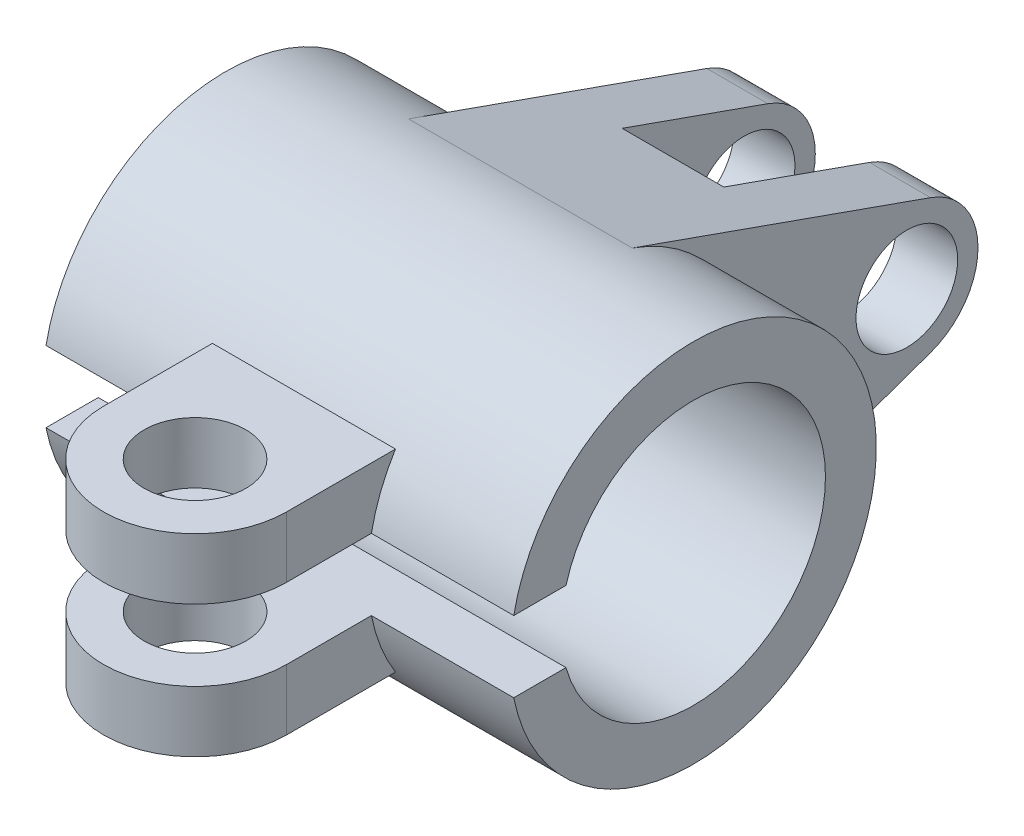
ISO-10303-21;
HEADER;
FILE_DESCRIPTION(('STEP AP214'),'2;1');
FILE_NAME('part.step','',(''),(''),'','','');
FILE_SCHEMA(('AUTOMOTIVE_DESIGN { 1 0 10303 214 1 1 1 1 }'));
ENDSEC;
DATA;
#1=APPLICATION_CONTEXT('core data for automotive mechanical design processes');
#2=APPLICATION_PROTOCOL_DEFINITION('international standard','automotive_design',2000,#1);
#3=PRODUCT_CONTEXT('',#1,'mechanical');
#4=PRODUCT('Part','Part','',(#3));
#5=PRODUCT_RELATED_PRODUCT_CATEGORY('part','',(#4));
#6=PRODUCT_DEFINITION_FORMATION('','',#4);
#7=PRODUCT_DEFINITION_CONTEXT('part definition',#1,'design');
#8=PRODUCT_DEFINITION('design','',#6,#7);
#9=PRODUCT_DEFINITION_SHAPE('','',#8);
#10=(LENGTH_UNIT() NAMED_UNIT(*) SI_UNIT(.MILLI.,.METRE.));
#11=(NAMED_UNIT(*) PLANE_ANGLE_UNIT() SI_UNIT($,.RADIAN.));
#12=(NAMED_UNIT(*) SI_UNIT($,.STERADIAN.) SOLID_ANGLE_UNIT());
#13=UNCERTAINTY_MEASURE_WITH_UNIT(LENGTH_MEASURE(1.E-05),#10,'distance_accuracy_value','');
#14=(GEOMETRIC_REPRESENTATION_CONTEXT(3) GLOBAL_UNCERTAINTY_ASSIGNED_CONTEXT((#13)) GLOBAL_UNIT_ASSIGNED_CONTEXT((#10,
#11,#12)) REPRESENTATION_CONTEXT('',''));
#15=CARTESIAN_POINT('',(0.,0.,0.));
#16=DIRECTION('',(0.,0.,1.));
#17=DIRECTION('',(1.,0.,0.));
#18=AXIS2_PLACEMENT_3D('',#15,#16,#17);
#19=CARTESIAN_POINT('',(0.,-3.5,26.));
#20=DIRECTION('',(0.,-1.,0.));
#21=DIRECTION('',(0.,0.,-1.));
#22=AXIS2_PLACEMENT_3D('',#19,#20,#21);
#23=CYLINDRICAL_SURFACE('',#22,9.);
#24=DIRECTION('',(0.,1.,0.));
#25=VECTOR('',#24,1.);
#26=CARTESIAN_POINT('',(9.,-3.5,26.));
#27=LINE('',#26,#25);
#28=CARTESIAN_POINT('',(9.,-3.5,26.));
#29=VERTEX_POINT('',#28);
#30=CARTESIAN_POINT('',(9.,-9.5,26.));
#31=VERTEX_POINT('',#30);
#32=EDGE_CURVE('E343',#29,#31,#27,.F.);
#33=ORIENTED_EDGE('',*,*,#32,.F.);
#34=CARTESIAN_POINT('',(0.,-3.5,26.));
#35=DIRECTION('',(0.,-1.,0.));
#36=DIRECTION('',(0.,0.,-1.));
#37=AXIS2_PLACEMENT_3D('',#34,#35,#36);
#38=CIRCLE('',#37,9.);
#39=CARTESIAN_POINT('',(-9.,-3.5,26.));
#40=VERTEX_POINT('',#39);
#41=EDGE_CURVE('E54',#40,#29,#38,.F.);
#42=ORIENTED_EDGE('',*,*,#41,.F.);
#43=DIRECTION('',(0.,-1.,0.));
#44=VECTOR('',#43,1.);
#45=CARTESIAN_POINT('',(-9.,0.,26.));
#46=LINE('',#45,#44);
#47=CARTESIAN_POINT('',(-9.,-9.5,26.));
#48=VERTEX_POINT('',#47);
#49=EDGE_CURVE('E205',#48,#40,#46,.F.);
#50=ORIENTED_EDGE('',*,*,#49,.F.);
#51=CARTESIAN_POINT('',(0.,-9.5,26.));
#52=DIRECTION('',(0.,1.,0.));
#53=DIRECTION('',(0.,0.,1.));
#54=AXIS2_PLACEMENT_3D('',#51,#52,#53);
#55=CIRCLE('',#54,9.);
#56=EDGE_CURVE('E11',#31,#48,#55,.F.);
#57=ORIENTED_EDGE('',*,*,#56,.F.);
#58=EDGE_LOOP('',(#33,#42,#50,#57));
#59=FACE_BOUND('',#58,.T.);
#60=ADVANCED_FACE('F45',(#59),#23,.T.);
#61=CARTESIAN_POINT('',(0.,9.5,26.));
#62=DIRECTION('',(0.,1.,0.));
#63=DIRECTION('',(0.,0.,1.));
#64=AXIS2_PLACEMENT_3D('',#61,#62,#63);
#65=CYLINDRICAL_SURFACE('',#64,9.);
#66=DIRECTION('',(0.,1.,0.));
#67=VECTOR('',#66,1.);
#68=CARTESIAN_POINT('',(9.,0.,26.));
#69=LINE('',#68,#67);
#70=CARTESIAN_POINT('',(9.,9.5,26.));
#71=VERTEX_POINT('',#70);
#72=CARTESIAN_POINT('',(9.,3.5,26.));
#73=VERTEX_POINT('',#72);
#74=EDGE_CURVE('E333',#71,#73,#69,.F.);
#75=ORIENTED_EDGE('',*,*,#74,.F.);
#76=CARTESIAN_POINT('',(0.,9.5,26.));
#77=DIRECTION('',(0.,1.,0.));
#78=DIRECTION('',(0.,0.,1.));
#79=AXIS2_PLACEMENT_3D('',#76,#77,#78);
#80=CIRCLE('',#79,9.);
#81=CARTESIAN_POINT('',(-9.,9.5,26.));
#82=VERTEX_POINT('',#81);
#83=EDGE_CURVE('E339',#82,#71,#80,.T.);
#84=ORIENTED_EDGE('',*,*,#83,.F.);
#85=DIRECTION('',(0.,-1.,0.));
#86=VECTOR('',#85,1.);
#87=CARTESIAN_POINT('',(-9.,9.5,26.));
#88=LINE('',#87,#86);
#89=CARTESIAN_POINT('',(-9.,3.5,26.));
#90=VERTEX_POINT('',#89);
#91=EDGE_CURVE('E336',#90,#82,#88,.F.);
#92=ORIENTED_EDGE('',*,*,#91,.F.);
#93=CARTESIAN_POINT('',(0.,3.5,26.));
#94=DIRECTION('',(0.,-1.,0.));
#95=DIRECTION('',(0.,0.,-1.));
#96=AXIS2_PLACEMENT_3D('',#93,#94,#95);
#97=CIRCLE('',#96,9.);
#98=EDGE_CURVE('E341',#73,#90,#97,.T.);
#99=ORIENTED_EDGE('',*,*,#98,.F.);
#100=EDGE_LOOP('',(#75,#84,#92,#99));
#101=FACE_BOUND('',#100,.T.);
#102=ADVANCED_FACE('F394',(#101),#65,.T.);
#103=CARTESIAN_POINT('',(11.,0.,-21.));
#104=DIRECTION('',(0.,0.,-1.));
#105=DIRECTION('',(0.,1.,0.));
#106=AXIS2_PLACEMENT_3D('',#103,#104,#105);
#107=PLANE('',#106);
#108=DIRECTION('',(0.,-1.,0.));
#109=VECTOR('',#108,1.);
#110=CARTESIAN_POINT('',(-5.,0.,-21.));
#111=LINE('',#110,#109);
#112=CARTESIAN_POINT('',(-5.,11.667261889578,-21.));
#113=VERTEX_POINT('',#112);
#114=CARTESIAN_POINT('',(-5.,-11.667261889578,-21.));
#115=VERTEX_POINT('',#114);
#116=EDGE_CURVE('E248',#113,#115,#111,.T.);
#117=ORIENTED_EDGE('',*,*,#116,.F.);
#118=DIRECTION('',(-1.,0.,0.));
#119=VECTOR('',#118,1.);
#120=CARTESIAN_POINT('',(11.,11.667261889578,-21.));
#121=LINE('',#120,#119);
#122=CARTESIAN_POINT('',(5.,11.667261889578,-21.));
#123=VERTEX_POINT('',#122);
#124=EDGE_CURVE('E298',#123,#113,#121,.T.);
#125=ORIENTED_EDGE('',*,*,#124,.F.);
#126=DIRECTION('',(0.,-1.,0.));
#127=VECTOR('',#126,1.);
#128=CARTESIAN_POINT('',(5.,0.,-21.));
#129=LINE('',#128,#127);
#130=CARTESIAN_POINT('',(5.,-11.667261889578,-21.));
#131=VERTEX_POINT('',#130);
#132=EDGE_CURVE('E270',#123,#131,#129,.T.);
#133=ORIENTED_EDGE('',*,*,#132,.T.);
#134=DIRECTION('',(-1.,0.,0.));
#135=VECTOR('',#134,1.);
#136=CARTESIAN_POINT('',(11.,-11.667261889578,-21.));
#137=LINE('',#136,#135);
#138=EDGE_CURVE('E301',#131,#115,#137,.T.);
#139=ORIENTED_EDGE('',*,*,#138,.T.);
#140=EDGE_LOOP('',(#117,#125,#133,#139));
#141=FACE_BOUND('',#140,.T.);
#142=ADVANCED_FACE('F398',(#141),#107,.T.);
#143=CARTESIAN_POINT('',(23.,0.,0.));
#144=DIRECTION('',(-1.,0.,0.));
#145=DIRECTION('',(0.,0.,1.));
#146=AXIS2_PLACEMENT_3D('',#143,#144,#145);
#147=CYLINDRICAL_SURFACE('',#146,18.);
#148=DIRECTION('',(-1.,0.,0.));
#149=VECTOR('',#148,1.);
#150=CARTESIAN_POINT('',(11.,-16.9705627484771,-6.));
#151=LINE('',#150,#149);
#152=CARTESIAN_POINT('',(11.,-16.9705627484771,-6.00000000000001));
#153=VERTEX_POINT('',#152);
#154=CARTESIAN_POINT('',(-11.,-16.9705627484771,-6.));
#155=VERTEX_POINT('',#154);
#156=EDGE_CURVE('E304',#153,#155,#151,.T.);
#157=ORIENTED_EDGE('',*,*,#156,.F.);
#158=CARTESIAN_POINT('',(11.,0.,0.));
#159=DIRECTION('',(1.,0.,0.));
#160=DIRECTION('',(0.,0.,-1.));
#161=AXIS2_PLACEMENT_3D('',#158,#159,#160);
#162=CIRCLE('',#161,18.);
#163=CARTESIAN_POINT('',(11.,16.9705627484771,-6.));
#164=VERTEX_POINT('',#163);
#165=EDGE_CURVE('E280',#153,#164,#162,.T.);
#166=ORIENTED_EDGE('',*,*,#165,.T.);
#167=DIRECTION('',(-1.,0.,0.));
#168=VECTOR('',#167,1.);
#169=CARTESIAN_POINT('',(11.,16.9705627484771,-6.));
#170=LINE('',#169,#168);
#171=CARTESIAN_POINT('',(-11.,16.9705627484771,-6.));
#172=VERTEX_POINT('',#171);
#173=EDGE_CURVE('E289',#164,#172,#170,.T.);
#174=ORIENTED_EDGE('',*,*,#173,.T.);
#175=CARTESIAN_POINT('',(-11.,0.,0.));
#176=DIRECTION('',(1.,0.,0.));
#177=DIRECTION('',(0.,0.,-1.));
#178=AXIS2_PLACEMENT_3D('',#175,#176,#177);
#179=CIRCLE('',#178,18.);
#180=EDGE_CURVE('E279',#155,#172,#179,.T.);
#181=ORIENTED_EDGE('',*,*,#180,.F.);
#182=EDGE_LOOP('',(#157,#166,#174,#181));
#183=FACE_BOUND('',#182,.T.);
#184=DIRECTION('',(-1.,0.,0.));
#185=VECTOR('',#184,1.);
#186=CARTESIAN_POINT('',(23.,-3.5,17.6564435830096));
#187=LINE('',#186,#185);
#188=CARTESIAN_POINT('',(23.,-3.5,17.6564435830096));
#189=VERTEX_POINT('',#188);
#190=CARTESIAN_POINT('',(9.,-3.5,17.6564435830096));
#191=VERTEX_POINT('',#190);
#192=EDGE_CURVE('E190',#189,#191,#187,.T.);
#193=ORIENTED_EDGE('',*,*,#192,.T.);
#194=CARTESIAN_POINT('',(9.,0.,0.));
#195=DIRECTION('',(1.,0.,0.));
#196=DIRECTION('',(0.,0.,-1.));
#197=AXIS2_PLACEMENT_3D('',#194,#195,#196);
#198=CIRCLE('',#197,18.);
#199=CARTESIAN_POINT('',(9.,-9.5,15.2888848514207));
#200=VERTEX_POINT('',#199);
#201=EDGE_CURVE('E208',#191,#200,#198,.T.);
#202=ORIENTED_EDGE('',*,*,#201,.T.);
#203=DIRECTION('',(-1.,0.,0.));
#204=VECTOR('',#203,1.);
#205=CARTESIAN_POINT('',(9.,-9.5,15.2888848514207));
#206=LINE('',#205,#204);
#207=CARTESIAN_POINT('',(-9.,-9.5,15.2888848514207));
#208=VERTEX_POINT('',#207);
#209=EDGE_CURVE('E199',#200,#208,#206,.T.);
#210=ORIENTED_EDGE('',*,*,#209,.T.);
#211=CARTESIAN_POINT('',(-9.,0.,0.));
#212=DIRECTION('',(1.,0.,0.));
#213=DIRECTION('',(0.,0.,-1.));
#214=AXIS2_PLACEMENT_3D('',#211,#212,#213);
#215=CIRCLE('',#214,18.);
#216=CARTESIAN_POINT('',(-9.,-3.5,17.6564435830096));
#217=VERTEX_POINT('',#216);
#218=EDGE_CURVE('E195',#217,#208,#215,.T.);
#219=ORIENTED_EDGE('',*,*,#218,.F.);
#220=CARTESIAN_POINT('',(-23.,-3.5,17.6564435830096));
#221=VERTEX_POINT('',#220);
#222=EDGE_CURVE('E180',#217,#221,#187,.T.);
#223=ORIENTED_EDGE('',*,*,#222,.T.);
#224=CARTESIAN_POINT('',(-23.,0.,0.));
#225=DIRECTION('',(1.,0.,0.));
#226=DIRECTION('',(0.,0.,-1.));
#227=AXIS2_PLACEMENT_3D('',#224,#225,#226);
#228=CIRCLE('',#227,18.);
#229=CARTESIAN_POINT('',(-23.,3.5,17.6564435830096));
#230=VERTEX_POINT('',#229);
#231=EDGE_CURVE('E307',#221,#230,#228,.T.);
#232=ORIENTED_EDGE('',*,*,#231,.T.);
#233=DIRECTION('',(-1.,0.,0.));
#234=VECTOR('',#233,1.);
#235=CARTESIAN_POINT('',(23.,3.5,17.6564435830096));
#236=LINE('',#235,#234);
#237=CARTESIAN_POINT('',(-9.,3.5,17.6564435830096));
#238=VERTEX_POINT('',#237);
#239=EDGE_CURVE('E329',#238,#230,#236,.T.);
#240=ORIENTED_EDGE('',*,*,#239,.F.);
#241=CARTESIAN_POINT('',(-9.,0.,0.));
#242=DIRECTION('',(1.,0.,0.));
#243=DIRECTION('',(0.,0.,-1.));
#244=AXIS2_PLACEMENT_3D('',#241,#242,#243);
#245=CIRCLE('',#244,18.);
#246=CARTESIAN_POINT('',(-9.,9.5,15.2888848514207));
#247=VERTEX_POINT('',#246);
#248=EDGE_CURVE('E213',#247,#238,#245,.T.);
#249=ORIENTED_EDGE('',*,*,#248,.F.);
#250=DIRECTION('',(-1.,0.,0.));
#251=VECTOR('',#250,1.);
#252=CARTESIAN_POINT('',(9.,9.5,15.2888848514207));
#253=LINE('',#252,#251);
#254=CARTESIAN_POINT('',(9.,9.5,15.2888848514207));
#255=VERTEX_POINT('',#254);
#256=EDGE_CURVE('E224',#255,#247,#253,.T.);
#257=ORIENTED_EDGE('',*,*,#256,.F.);
#258=CARTESIAN_POINT('',(9.,0.,0.));
#259=DIRECTION('',(1.,0.,0.));
#260=DIRECTION('',(0.,0.,-1.));
#261=AXIS2_PLACEMENT_3D('',#258,#259,#260);
#262=CIRCLE('',#261,18.);
#263=CARTESIAN_POINT('',(9.,3.5,17.6564435830096));
#264=VERTEX_POINT('',#263);
#265=EDGE_CURVE('E215',#255,#264,#262,.T.);
#266=ORIENTED_EDGE('',*,*,#265,.T.);
#267=CARTESIAN_POINT('',(23.,3.5,17.6564435830096));
#268=VERTEX_POINT('',#267);
#269=EDGE_CURVE('E330',#268,#264,#236,.T.);
#270=ORIENTED_EDGE('',*,*,#269,.F.);
#271=CARTESIAN_POINT('',(23.,0.,0.));
#272=DIRECTION('',(1.,0.,0.));
#273=DIRECTION('',(0.,0.,-1.));
#274=AXIS2_PLACEMENT_3D('',#271,#272,#273);
#275=CIRCLE('',#274,18.);
#276=EDGE_CURVE('E308',#189,#268,#275,.T.);
#277=ORIENTED_EDGE('',*,*,#276,.F.);
#278=EDGE_LOOP('',(#193,#202,#210,#219,#223,#232,#240,#249,#257,#266,#270,#277));
#279=FACE_BOUND('',#278,.T.);
#280=ADVANCED_FACE('F196',(#183,#279),#147,.T.);
#281=CARTESIAN_POINT('',(23.,3.5,0.));
#282=DIRECTION('',(0.,-1.,0.));
#283=DIRECTION('',(0.,0.,-1.));
#284=AXIS2_PLACEMENT_3D('',#281,#282,#283);
#285=PLANE('',#284);
#286=CARTESIAN_POINT('',(0.,3.5,26.));
#287=DIRECTION('',(0.,-1.,0.));
#288=DIRECTION('',(0.,0.,-1.));
#289=AXIS2_PLACEMENT_3D('',#286,#287,#288);
#290=CIRCLE('',#289,5.);
#291=CARTESIAN_POINT('',(0.,3.5,21.));
#292=VERTEX_POINT('',#291);
#293=EDGE_CURVE('E202',#292,#292,#290,.T.);
#294=ORIENTED_EDGE('',*,*,#293,.F.);
#295=EDGE_LOOP('',(#294));
#296=FACE_BOUND('',#295,.T.);
#297=DIRECTION('',(0.,0.,1.));
#298=VECTOR('',#297,1.);
#299=CARTESIAN_POINT('',(9.,3.5,0.));
#300=LINE('',#299,#298);
#301=EDGE_CURVE('E221',#264,#73,#300,.T.);
#302=ORIENTED_EDGE('',*,*,#301,.T.);
#303=ORIENTED_EDGE('',*,*,#98,.T.);
#304=DIRECTION('',(0.,0.,1.));
#305=VECTOR('',#304,1.);
#306=CARTESIAN_POINT('',(-9.,3.5,0.));
#307=LINE('',#306,#305);
#308=EDGE_CURVE('E219',#238,#90,#307,.T.);
#309=ORIENTED_EDGE('',*,*,#308,.F.);
#310=ORIENTED_EDGE('',*,*,#239,.T.);
#311=DIRECTION('',(0.,0.,1.));
#312=VECTOR('',#311,1.);
#313=CARTESIAN_POINT('',(-23.,3.5,0.));
#314=LINE('',#313,#312);
#315=CARTESIAN_POINT('',(-23.,3.5,12.5199840255489));
#316=VERTEX_POINT('',#315);
#317=EDGE_CURVE('E318',#316,#230,#314,.T.);
#318=ORIENTED_EDGE('',*,*,#317,.F.);
#319=DIRECTION('',(-1.,0.,0.));
#320=VECTOR('',#319,1.);
#321=CARTESIAN_POINT('',(23.,3.5,12.5199840255489));
#322=LINE('',#321,#320);
#323=CARTESIAN_POINT('',(23.,3.5,12.5199840255489));
#324=VERTEX_POINT('',#323);
#325=EDGE_CURVE('E327',#324,#316,#322,.T.);
#326=ORIENTED_EDGE('',*,*,#325,.F.);
#327=DIRECTION('',(0.,0.,1.));
#328=VECTOR('',#327,1.);
#329=CARTESIAN_POINT('',(23.,3.5,0.));
#330=LINE('',#329,#328);
#331=EDGE_CURVE('E310',#324,#268,#330,.T.);
#332=ORIENTED_EDGE('',*,*,#331,.T.);
#333=ORIENTED_EDGE('',*,*,#269,.T.);
#334=EDGE_LOOP('',(#302,#303,#309,#310,#318,#326,#332,#333));
#335=FACE_BOUND('',#334,.T.);
#336=ADVANCED_FACE('F389',(#296,#335),#285,.T.);
#337=CARTESIAN_POINT('',(23.,0.,0.));
#338=DIRECTION('',(-1.,0.,0.));
#339=DIRECTION('',(0.,0.,1.));
#340=AXIS2_PLACEMENT_3D('',#337,#338,#339);
#341=CYLINDRICAL_SURFACE('',#340,13.);
#342=CARTESIAN_POINT('',(-23.,0.,0.));
#343=DIRECTION('',(1.,0.,0.));
#344=DIRECTION('',(0.,0.,-1.));
#345=AXIS2_PLACEMENT_3D('',#342,#343,#344);
#346=CIRCLE('',#345,13.);
#347=CARTESIAN_POINT('',(-23.,-3.5,12.5199840255489));
#348=VERTEX_POINT('',#347);
#349=EDGE_CURVE('E321',#348,#316,#346,.T.);
#350=ORIENTED_EDGE('',*,*,#349,.F.);
#351=DIRECTION('',(-1.,0.,0.));
#352=VECTOR('',#351,1.);
#353=CARTESIAN_POINT('',(23.,-3.5,12.5199840255489));
#354=LINE('',#353,#352);
#355=CARTESIAN_POINT('',(23.,-3.5,12.5199840255489));
#356=VERTEX_POINT('',#355);
#357=EDGE_CURVE('E325',#356,#348,#354,.T.);
#358=ORIENTED_EDGE('',*,*,#357,.F.);
#359=CARTESIAN_POINT('',(23.,0.,0.));
#360=DIRECTION('',(1.,0.,0.));
#361=DIRECTION('',(0.,0.,-1.));
#362=AXIS2_PLACEMENT_3D('',#359,#360,#361);
#363=CIRCLE('',#362,13.);
#364=EDGE_CURVE('E313',#356,#324,#363,.T.);
#365=ORIENTED_EDGE('',*,*,#364,.T.);
#366=ORIENTED_EDGE('',*,*,#325,.T.);
#367=EDGE_LOOP('',(#350,#358,#365,#366));
#368=FACE_BOUND('',#367,.T.);
#369=ADVANCED_FACE('F380',(#368),#341,.F.);
#370=CARTESIAN_POINT('',(23.,-3.5,0.));
#371=DIRECTION('',(0.,-1.,0.));
#372=DIRECTION('',(0.,0.,-1.));
#373=AXIS2_PLACEMENT_3D('',#370,#371,#372);
#374=PLANE('',#373);
#375=CARTESIAN_POINT('',(0.,-3.5,26.));
#376=DIRECTION('',(0.,-1.,0.));
#377=DIRECTION('',(0.,0.,-1.));
#378=AXIS2_PLACEMENT_3D('',#375,#376,#377);
#379=CIRCLE('',#378,5.);
#380=CARTESIAN_POINT('',(0.,-3.5,21.));
#381=VERTEX_POINT('',#380);
#382=EDGE_CURVE('E359',#381,#381,#379,.T.);
#383=ORIENTED_EDGE('',*,*,#382,.T.);
#384=EDGE_LOOP('',(#383));
#385=FACE_BOUND('',#384,.T.);
#386=DIRECTION('',(0.,0.,1.));
#387=VECTOR('',#386,1.);
#388=CARTESIAN_POINT('',(-9.,-3.5,0.));
#389=LINE('',#388,#387);
#390=EDGE_CURVE('E184',#217,#40,#389,.T.);
#391=ORIENTED_EDGE('',*,*,#390,.T.);
#392=ORIENTED_EDGE('',*,*,#41,.T.);
#393=DIRECTION('',(0.,0.,1.));
#394=VECTOR('',#393,1.);
#395=CARTESIAN_POINT('',(9.,-3.5,0.));
#396=LINE('',#395,#394);
#397=EDGE_CURVE('E350',#191,#29,#396,.T.);
#398=ORIENTED_EDGE('',*,*,#397,.F.);
#399=ORIENTED_EDGE('',*,*,#192,.F.);
#400=DIRECTION('',(0.,0.,1.));
#401=VECTOR('',#400,1.);
#402=CARTESIAN_POINT('',(23.,-3.5,0.));
#403=LINE('',#402,#401);
#404=EDGE_CURVE('E191',#356,#189,#403,.T.);
#405=ORIENTED_EDGE('',*,*,#404,.F.);
#406=ORIENTED_EDGE('',*,*,#357,.T.);
#407=DIRECTION('',(0.,0.,1.));
#408=VECTOR('',#407,1.);
#409=CARTESIAN_POINT('',(-23.,-3.5,0.));
#410=LINE('',#409,#408);
#411=EDGE_CURVE('E186',#348,#221,#410,.T.);
#412=ORIENTED_EDGE('',*,*,#411,.T.);
#413=ORIENTED_EDGE('',*,*,#222,.F.);
#414=EDGE_LOOP('',(#391,#392,#398,#399,#405,#406,#412,#413));
#415=FACE_BOUND('',#414,.T.);
#416=ADVANCED_FACE('F182',(#385,#415),#374,.F.);
#417=CARTESIAN_POINT('',(23.,0.,0.));
#418=DIRECTION('',(1.,0.,0.));
#419=DIRECTION('',(0.,0.,-1.));
#420=AXIS2_PLACEMENT_3D('',#417,#418,#419);
#421=PLANE('',#420);
#422=ORIENTED_EDGE('',*,*,#276,.T.);
#423=ORIENTED_EDGE('',*,*,#331,.F.);
#424=ORIENTED_EDGE('',*,*,#364,.F.);
#425=ORIENTED_EDGE('',*,*,#404,.T.);
#426=EDGE_LOOP('',(#422,#423,#424,#425));
#427=FACE_BOUND('',#426,.T.);
#428=ADVANCED_FACE('F379',(#427),#421,.T.);
#429=CARTESIAN_POINT('',(-23.,0.,0.));
#430=DIRECTION('',(1.,0.,0.));
#431=DIRECTION('',(0.,0.,-1.));
#432=AXIS2_PLACEMENT_3D('',#429,#430,#431);
#433=PLANE('',#432);
#434=ORIENTED_EDGE('',*,*,#231,.F.);
#435=ORIENTED_EDGE('',*,*,#411,.F.);
#436=ORIENTED_EDGE('',*,*,#349,.T.);
#437=ORIENTED_EDGE('',*,*,#317,.T.);
#438=EDGE_LOOP('',(#434,#435,#436,#437));
#439=FACE_BOUND('',#438,.T.);
#440=ADVANCED_FACE('F386',(#439),#433,.F.);
#441=CARTESIAN_POINT('',(11.,-16.9705627484771,-6.00000000000001));
#442=DIRECTION('',(0.,-0.942809041582063,-0.333333333333334));
#443=DIRECTION('',(0.,0.333333333333334,-0.942809041582063));
#444=AXIS2_PLACEMENT_3D('',#441,#442,#443);
#445=PLANE('',#444);
#446=DIRECTION('',(0.,-0.333333333333334,0.942809041582063));
#447=VECTOR('',#446,1.);
#448=CARTESIAN_POINT('',(-11.,-16.9705627484771,-6.00000000000001));
#449=LINE('',#448,#447);
#450=CARTESIAN_POINT('',(-11.,-6.59966329107444,-35.3333333333333));
#451=VERTEX_POINT('',#450);
#452=EDGE_CURVE('E292',#451,#155,#449,.T.);
#453=ORIENTED_EDGE('',*,*,#452,.F.);
#454=DIRECTION('',(1.,0.,0.));
#455=VECTOR('',#454,1.);
#456=CARTESIAN_POINT('',(-11.,-6.59966329107444,-35.3333333333333));
#457=LINE('',#456,#455);
#458=CARTESIAN_POINT('',(-5.,-6.59966329107444,-35.3333333333333));
#459=VERTEX_POINT('',#458);
#460=EDGE_CURVE('E241',#451,#459,#457,.T.);
#461=ORIENTED_EDGE('',*,*,#460,.T.);
#462=DIRECTION('',(0.,-0.333333333333334,0.942809041582063));
#463=VECTOR('',#462,1.);
#464=CARTESIAN_POINT('',(-5.,-16.9705627484771,-6.00000000000001));
#465=LINE('',#464,#463);
#466=EDGE_CURVE('E233',#459,#115,#465,.T.);
#467=ORIENTED_EDGE('',*,*,#466,.T.);
#468=ORIENTED_EDGE('',*,*,#138,.F.);
#469=DIRECTION('',(0.,-0.333333333333334,0.942809041582063));
#470=VECTOR('',#469,1.);
#471=CARTESIAN_POINT('',(5.,-16.9705627484771,-6.00000000000001));
#472=LINE('',#471,#470);
#473=CARTESIAN_POINT('',(5.,-6.59966329107444,-35.3333333333333));
#474=VERTEX_POINT('',#473);
#475=EDGE_CURVE('E255',#474,#131,#472,.T.);
#476=ORIENTED_EDGE('',*,*,#475,.F.);
#477=DIRECTION('',(-1.,0.,0.));
#478=VECTOR('',#477,1.);
#479=CARTESIAN_POINT('',(11.,-6.59966329107444,-35.3333333333333));
#480=LINE('',#479,#478);
#481=CARTESIAN_POINT('',(11.,-6.59966329107444,-35.3333333333333));
#482=VERTEX_POINT('',#481);
#483=EDGE_CURVE('E277',#482,#474,#480,.T.);
#484=ORIENTED_EDGE('',*,*,#483,.F.);
#485=DIRECTION('',(0.,-0.333333333333334,0.942809041582063));
#486=VECTOR('',#485,1.);
#487=CARTESIAN_POINT('',(11.,-16.9705627484771,-6.00000000000001));
#488=LINE('',#487,#486);
#489=EDGE_CURVE('E282',#482,#153,#488,.T.);
#490=ORIENTED_EDGE('',*,*,#489,.T.);
#491=ORIENTED_EDGE('',*,*,#156,.T.);
#492=EDGE_LOOP('',(#453,#461,#467,#468,#476,#484,#490,#491));
#493=FACE_BOUND('',#492,.T.);
#494=ADVANCED_FACE('F489',(#493),#445,.T.);
#495=CARTESIAN_POINT('',(11.,16.9705627484771,-6.));
#496=DIRECTION('',(0.,-0.942809041582063,0.333333333333333));
#497=DIRECTION('',(0.,-0.333333333333333,-0.942809041582063));
#498=AXIS2_PLACEMENT_3D('',#495,#496,#497);
#499=PLANE('',#498);
#500=DIRECTION('',(0.,0.333333333333333,0.942809041582063));
#501=VECTOR('',#500,1.);
#502=CARTESIAN_POINT('',(-11.,16.9705627484771,-6.));
#503=LINE('',#502,#501);
#504=CARTESIAN_POINT('',(-11.,6.59966329107444,-35.3333333333333));
#505=VERTEX_POINT('',#504);
#506=EDGE_CURVE('E283',#505,#172,#503,.T.);
#507=ORIENTED_EDGE('',*,*,#506,.T.);
#508=ORIENTED_EDGE('',*,*,#173,.F.);
#509=DIRECTION('',(0.,0.333333333333333,0.942809041582063));
#510=VECTOR('',#509,1.);
#511=CARTESIAN_POINT('',(11.,16.9705627484771,-6.));
#512=LINE('',#511,#510);
#513=CARTESIAN_POINT('',(11.,6.59966329107444,-35.3333333333333));
#514=VERTEX_POINT('',#513);
#515=EDGE_CURVE('E286',#514,#164,#512,.T.);
#516=ORIENTED_EDGE('',*,*,#515,.F.);
#517=DIRECTION('',(-1.,0.,0.));
#518=VECTOR('',#517,1.);
#519=CARTESIAN_POINT('',(11.,6.59966329107444,-35.3333333333333));
#520=LINE('',#519,#518);
#521=CARTESIAN_POINT('',(5.,6.59966329107444,-35.3333333333333));
#522=VERTEX_POINT('',#521);
#523=EDGE_CURVE('E264',#514,#522,#520,.T.);
#524=ORIENTED_EDGE('',*,*,#523,.T.);
#525=DIRECTION('',(0.,0.333333333333333,0.942809041582063));
#526=VECTOR('',#525,1.);
#527=CARTESIAN_POINT('',(5.,16.9705627484771,-6.));
#528=LINE('',#527,#526);
#529=EDGE_CURVE('E268',#522,#123,#528,.T.);
#530=ORIENTED_EDGE('',*,*,#529,.T.);
#531=ORIENTED_EDGE('',*,*,#124,.T.);
#532=DIRECTION('',(0.,0.333333333333333,0.942809041582063));
#533=VECTOR('',#532,1.);
#534=CARTESIAN_POINT('',(-5.,16.9705627484771,-6.));
#535=LINE('',#534,#533);
#536=CARTESIAN_POINT('',(-5.,6.59966329107444,-35.3333333333333));
#537=VERTEX_POINT('',#536);
#538=EDGE_CURVE('E246',#537,#113,#535,.T.);
#539=ORIENTED_EDGE('',*,*,#538,.F.);
#540=DIRECTION('',(1.,0.,0.));
#541=VECTOR('',#540,1.);
#542=CARTESIAN_POINT('',(-11.,6.59966329107444,-35.3333333333333));
#543=LINE('',#542,#541);
#544=EDGE_CURVE('E253',#505,#537,#543,.T.);
#545=ORIENTED_EDGE('',*,*,#544,.F.);
#546=EDGE_LOOP('',(#507,#508,#516,#524,#530,#531,#539,#545));
#547=FACE_BOUND('',#546,.T.);
#548=ADVANCED_FACE('F483',(#547),#499,.F.);
#549=CARTESIAN_POINT('',(11.,0.,0.));
#550=DIRECTION('',(1.,0.,0.));
#551=DIRECTION('',(0.,0.,-1.));
#552=AXIS2_PLACEMENT_3D('',#549,#550,#551);
#553=PLANE('',#552);
#554=ORIENTED_EDGE('',*,*,#165,.F.);
#555=ORIENTED_EDGE('',*,*,#489,.F.);
#556=CARTESIAN_POINT('',(11.,0.,-33.));
#557=DIRECTION('',(1.,0.,0.));
#558=DIRECTION('',(0.,0.,-1.));
#559=AXIS2_PLACEMENT_3D('',#556,#557,#558);
#560=CIRCLE('',#559,7.);
#561=EDGE_CURVE('E257',#482,#514,#560,.T.);
#562=ORIENTED_EDGE('',*,*,#561,.T.);
#563=ORIENTED_EDGE('',*,*,#515,.T.);
#564=EDGE_LOOP('',(#554,#555,#562,#563));
#565=FACE_BOUND('',#564,.T.);
#566=CARTESIAN_POINT('',(11.,0.,-33.));
#567=DIRECTION('',(1.,0.,0.));
#568=DIRECTION('',(0.,0.,-1.));
#569=AXIS2_PLACEMENT_3D('',#566,#567,#568);
#570=CIRCLE('',#569,5.);
#571=CARTESIAN_POINT('',(11.,0.,-38.));
#572=VERTEX_POINT('',#571);
#573=EDGE_CURVE('E260',#572,#572,#570,.T.);
#574=ORIENTED_EDGE('',*,*,#573,.F.);
#575=EDGE_LOOP('',(#574));
#576=FACE_BOUND('',#575,.T.);
#577=ADVANCED_FACE('F480',(#565,#576),#553,.T.);
#578=CARTESIAN_POINT('',(-11.,0.,0.));
#579=DIRECTION('',(1.,0.,0.));
#580=DIRECTION('',(0.,0.,-1.));
#581=AXIS2_PLACEMENT_3D('',#578,#579,#580);
#582=PLANE('',#581);
#583=ORIENTED_EDGE('',*,*,#180,.T.);
#584=ORIENTED_EDGE('',*,*,#506,.F.);
#585=CARTESIAN_POINT('',(-11.,0.,-33.));
#586=DIRECTION('',(1.,0.,0.));
#587=DIRECTION('',(0.,0.,-1.));
#588=AXIS2_PLACEMENT_3D('',#585,#586,#587);
#589=CIRCLE('',#588,7.);
#590=EDGE_CURVE('E234',#451,#505,#589,.T.);
#591=ORIENTED_EDGE('',*,*,#590,.F.);
#592=ORIENTED_EDGE('',*,*,#452,.T.);
#593=EDGE_LOOP('',(#583,#584,#591,#592));
#594=FACE_BOUND('',#593,.T.);
#595=CARTESIAN_POINT('',(-11.,0.,-33.));
#596=DIRECTION('',(1.,0.,0.));
#597=DIRECTION('',(0.,0.,-1.));
#598=AXIS2_PLACEMENT_3D('',#595,#596,#597);
#599=CIRCLE('',#598,5.);
#600=CARTESIAN_POINT('',(-11.,0.,-38.));
#601=VERTEX_POINT('',#600);
#602=EDGE_CURVE('E237',#601,#601,#599,.T.);
#603=ORIENTED_EDGE('',*,*,#602,.T.);
#604=EDGE_LOOP('',(#603));
#605=FACE_BOUND('',#604,.T.);
#606=ADVANCED_FACE('F478',(#594,#605),#582,.F.);
#607=CARTESIAN_POINT('',(11.,0.,-33.));
#608=DIRECTION('',(-1.,0.,0.));
#609=DIRECTION('',(0.,0.,1.));
#610=AXIS2_PLACEMENT_3D('',#607,#608,#609);
#611=CYLINDRICAL_SURFACE('',#610,7.);
#612=CARTESIAN_POINT('',(5.,0.,-33.));
#613=DIRECTION('',(1.,0.,0.));
#614=DIRECTION('',(0.,0.,-1.));
#615=AXIS2_PLACEMENT_3D('',#612,#613,#614);
#616=CIRCLE('',#615,7.);
#617=EDGE_CURVE('E266',#474,#522,#616,.T.);
#618=ORIENTED_EDGE('',*,*,#617,.T.);
#619=ORIENTED_EDGE('',*,*,#523,.F.);
#620=ORIENTED_EDGE('',*,*,#561,.F.);
#621=ORIENTED_EDGE('',*,*,#483,.T.);
#622=EDGE_LOOP('',(#618,#619,#620,#621));
#623=FACE_BOUND('',#622,.T.);
#624=ADVANCED_FACE('F474',(#623),#611,.T.);
#625=CARTESIAN_POINT('',(11.,0.,-33.));
#626=DIRECTION('',(-1.,0.,0.));
#627=DIRECTION('',(0.,0.,1.));
#628=AXIS2_PLACEMENT_3D('',#625,#626,#627);
#629=CYLINDRICAL_SURFACE('',#628,5.);
#630=ORIENTED_EDGE('',*,*,#573,.T.);
#631=EDGE_LOOP('',(#630));
#632=FACE_BOUND('',#631,.T.);
#633=CARTESIAN_POINT('',(5.,0.,-33.));
#634=DIRECTION('',(1.,0.,0.));
#635=DIRECTION('',(0.,0.,-1.));
#636=AXIS2_PLACEMENT_3D('',#633,#634,#635);
#637=CIRCLE('',#636,5.);
#638=CARTESIAN_POINT('',(5.,0.,-38.));
#639=VERTEX_POINT('',#638);
#640=EDGE_CURVE('E261',#639,#639,#637,.T.);
#641=ORIENTED_EDGE('',*,*,#640,.F.);
#642=EDGE_LOOP('',(#641));
#643=FACE_BOUND('',#642,.T.);
#644=ADVANCED_FACE('F470',(#632,#643),#629,.F.);
#645=CARTESIAN_POINT('',(5.,0.,0.));
#646=DIRECTION('',(1.,0.,0.));
#647=DIRECTION('',(0.,0.,-1.));
#648=AXIS2_PLACEMENT_3D('',#645,#646,#647);
#649=PLANE('',#648);
#650=ORIENTED_EDGE('',*,*,#475,.T.);
#651=ORIENTED_EDGE('',*,*,#132,.F.);
#652=ORIENTED_EDGE('',*,*,#529,.F.);
#653=ORIENTED_EDGE('',*,*,#617,.F.);
#654=EDGE_LOOP('',(#650,#651,#652,#653));
#655=FACE_BOUND('',#654,.T.);
#656=ORIENTED_EDGE('',*,*,#640,.T.);
#657=EDGE_LOOP('',(#656));
#658=FACE_BOUND('',#657,.T.);
#659=ADVANCED_FACE('F466',(#655,#658),#649,.F.);
#660=CARTESIAN_POINT('',(-11.,0.,-33.));
#661=DIRECTION('',(1.,0.,0.));
#662=DIRECTION('',(0.,0.,-1.));
#663=AXIS2_PLACEMENT_3D('',#660,#661,#662);
#664=CYLINDRICAL_SURFACE('',#663,7.);
#665=CARTESIAN_POINT('',(-5.,0.,-33.));
#666=DIRECTION('',(1.,0.,0.));
#667=DIRECTION('',(0.,0.,-1.));
#668=AXIS2_PLACEMENT_3D('',#665,#666,#667);
#669=CIRCLE('',#668,7.);
#670=EDGE_CURVE('E243',#459,#537,#669,.T.);
#671=ORIENTED_EDGE('',*,*,#670,.F.);
#672=ORIENTED_EDGE('',*,*,#460,.F.);
#673=ORIENTED_EDGE('',*,*,#590,.T.);
#674=ORIENTED_EDGE('',*,*,#544,.T.);
#675=EDGE_LOOP('',(#671,#672,#673,#674));
#676=FACE_BOUND('',#675,.T.);
#677=ADVANCED_FACE('F462',(#676),#664,.T.);
#678=CARTESIAN_POINT('',(-11.,0.,-33.));
#679=DIRECTION('',(1.,0.,0.));
#680=DIRECTION('',(0.,0.,-1.));
#681=AXIS2_PLACEMENT_3D('',#678,#679,#680);
#682=CYLINDRICAL_SURFACE('',#681,5.);
#683=ORIENTED_EDGE('',*,*,#602,.F.);
#684=EDGE_LOOP('',(#683));
#685=FACE_BOUND('',#684,.T.);
#686=CARTESIAN_POINT('',(-5.,0.,-33.));
#687=DIRECTION('',(1.,0.,0.));
#688=DIRECTION('',(0.,0.,-1.));
#689=AXIS2_PLACEMENT_3D('',#686,#687,#688);
#690=CIRCLE('',#689,5.);
#691=CARTESIAN_POINT('',(-5.,0.,-38.));
#692=VERTEX_POINT('',#691);
#693=EDGE_CURVE('E238',#692,#692,#690,.T.);
#694=ORIENTED_EDGE('',*,*,#693,.T.);
#695=EDGE_LOOP('',(#694));
#696=FACE_BOUND('',#695,.T.);
#697=ADVANCED_FACE('F458',(#685,#696),#682,.F.);
#698=CARTESIAN_POINT('',(-5.,0.,0.));
#699=DIRECTION('',(1.,0.,0.));
#700=DIRECTION('',(0.,0.,-1.));
#701=AXIS2_PLACEMENT_3D('',#698,#699,#700);
#702=PLANE('',#701);
#703=ORIENTED_EDGE('',*,*,#466,.F.);
#704=ORIENTED_EDGE('',*,*,#670,.T.);
#705=ORIENTED_EDGE('',*,*,#538,.T.);
#706=ORIENTED_EDGE('',*,*,#116,.T.);
#707=EDGE_LOOP('',(#703,#704,#705,#706));
#708=FACE_BOUND('',#707,.T.);
#709=ORIENTED_EDGE('',*,*,#693,.F.);
#710=EDGE_LOOP('',(#709));
#711=FACE_BOUND('',#710,.T.);
#712=ADVANCED_FACE('F454',(#708,#711),#702,.T.);
#713=CARTESIAN_POINT('',(9.,9.5,0.));
#714=DIRECTION('',(0.,1.,0.));
#715=DIRECTION('',(0.,0.,1.));
#716=AXIS2_PLACEMENT_3D('',#713,#714,#715);
#717=PLANE('',#716);
#718=CARTESIAN_POINT('',(0.,9.49999999999999,26.));
#719=DIRECTION('',(0.,1.,0.));
#720=DIRECTION('',(0.,0.,1.));
#721=AXIS2_PLACEMENT_3D('',#718,#719,#720);
#722=CIRCLE('',#721,5.);
#723=CARTESIAN_POINT('',(0.,9.49999999999999,31.));
#724=VERTEX_POINT('',#723);
#725=EDGE_CURVE('E362',#724,#724,#722,.T.);
#726=ORIENTED_EDGE('',*,*,#725,.F.);
#727=EDGE_LOOP('',(#726));
#728=FACE_BOUND('',#727,.T.);
#729=DIRECTION('',(0.,0.,-1.));
#730=VECTOR('',#729,1.);
#731=CARTESIAN_POINT('',(-9.,9.5,0.));
#732=LINE('',#731,#730);
#733=EDGE_CURVE('E227',#82,#247,#732,.T.);
#734=ORIENTED_EDGE('',*,*,#733,.F.);
#735=ORIENTED_EDGE('',*,*,#83,.T.);
#736=DIRECTION('',(0.,0.,-1.));
#737=VECTOR('',#736,1.);
#738=CARTESIAN_POINT('',(9.,9.5,0.));
#739=LINE('',#738,#737);
#740=EDGE_CURVE('E218',#71,#255,#739,.T.);
#741=ORIENTED_EDGE('',*,*,#740,.T.);
#742=ORIENTED_EDGE('',*,*,#256,.T.);
#743=EDGE_LOOP('',(#734,#735,#741,#742));
#744=FACE_BOUND('',#743,.T.);
#745=ADVANCED_FACE('F431',(#728,#744),#717,.T.);
#746=CARTESIAN_POINT('',(9.,0.,0.));
#747=DIRECTION('',(1.,0.,0.));
#748=DIRECTION('',(0.,0.,-1.));
#749=AXIS2_PLACEMENT_3D('',#746,#747,#748);
#750=PLANE('',#749);
#751=ORIENTED_EDGE('',*,*,#740,.F.);
#752=ORIENTED_EDGE('',*,*,#74,.T.);
#753=ORIENTED_EDGE('',*,*,#301,.F.);
#754=ORIENTED_EDGE('',*,*,#265,.F.);
#755=EDGE_LOOP('',(#751,#752,#753,#754));
#756=FACE_BOUND('',#755,.T.);
#757=ADVANCED_FACE('F424',(#756),#750,.T.);
#758=CARTESIAN_POINT('',(-9.,0.,0.));
#759=DIRECTION('',(1.,0.,0.));
#760=DIRECTION('',(0.,0.,-1.));
#761=AXIS2_PLACEMENT_3D('',#758,#759,#760);
#762=PLANE('',#761);
#763=ORIENTED_EDGE('',*,*,#308,.T.);
#764=ORIENTED_EDGE('',*,*,#91,.T.);
#765=ORIENTED_EDGE('',*,*,#733,.T.);
#766=ORIENTED_EDGE('',*,*,#248,.T.);
#767=EDGE_LOOP('',(#763,#764,#765,#766));
#768=FACE_BOUND('',#767,.T.);
#769=ADVANCED_FACE('F433',(#768),#762,.F.);
#770=CARTESIAN_POINT('',(9.,-9.5,0.));
#771=DIRECTION('',(0.,1.,0.));
#772=DIRECTION('',(0.,0.,1.));
#773=AXIS2_PLACEMENT_3D('',#770,#771,#772);
#774=PLANE('',#773);
#775=CARTESIAN_POINT('',(0.,-9.5,26.));
#776=DIRECTION('',(0.,1.,0.));
#777=DIRECTION('',(0.,0.,1.));
#778=AXIS2_PLACEMENT_3D('',#775,#776,#777);
#779=CIRCLE('',#778,5.);
#780=CARTESIAN_POINT('',(0.,-9.5,31.));
#781=VERTEX_POINT('',#780);
#782=EDGE_CURVE('E49',#781,#781,#779,.T.);
#783=ORIENTED_EDGE('',*,*,#782,.T.);
#784=EDGE_LOOP('',(#783));
#785=FACE_BOUND('',#784,.T.);
#786=DIRECTION('',(0.,0.,-1.));
#787=VECTOR('',#786,1.);
#788=CARTESIAN_POINT('',(9.,-9.5,0.));
#789=LINE('',#788,#787);
#790=EDGE_CURVE('E214',#31,#200,#789,.T.);
#791=ORIENTED_EDGE('',*,*,#790,.F.);
#792=ORIENTED_EDGE('',*,*,#56,.T.);
#793=DIRECTION('',(0.,0.,-1.));
#794=VECTOR('',#793,1.);
#795=CARTESIAN_POINT('',(-9.,-9.5,0.));
#796=LINE('',#795,#794);
#797=EDGE_CURVE('E206',#48,#208,#796,.T.);
#798=ORIENTED_EDGE('',*,*,#797,.T.);
#799=ORIENTED_EDGE('',*,*,#209,.F.);
#800=EDGE_LOOP('',(#791,#792,#798,#799));
#801=FACE_BOUND('',#800,.T.);
#802=ADVANCED_FACE('F369',(#785,#801),#774,.F.);
#803=CARTESIAN_POINT('',(9.,0.,0.));
#804=DIRECTION('',(1.,0.,0.));
#805=DIRECTION('',(0.,0.,-1.));
#806=AXIS2_PLACEMENT_3D('',#803,#804,#805);
#807=PLANE('',#806);
#808=ORIENTED_EDGE('',*,*,#397,.T.);
#809=ORIENTED_EDGE('',*,*,#32,.T.);
#810=ORIENTED_EDGE('',*,*,#790,.T.);
#811=ORIENTED_EDGE('',*,*,#201,.F.);
#812=EDGE_LOOP('',(#808,#809,#810,#811));
#813=FACE_BOUND('',#812,.T.);
#814=ADVANCED_FACE('F353',(#813),#807,.T.);
#815=CARTESIAN_POINT('',(-9.,0.,0.));
#816=DIRECTION('',(1.,0.,0.));
#817=DIRECTION('',(0.,0.,-1.));
#818=AXIS2_PLACEMENT_3D('',#815,#816,#817);
#819=PLANE('',#818);
#820=ORIENTED_EDGE('',*,*,#797,.F.);
#821=ORIENTED_EDGE('',*,*,#49,.T.);
#822=ORIENTED_EDGE('',*,*,#390,.F.);
#823=ORIENTED_EDGE('',*,*,#218,.T.);
#824=EDGE_LOOP('',(#820,#821,#822,#823));
#825=FACE_BOUND('',#824,.T.);
#826=ADVANCED_FACE('F204',(#825),#819,.F.);
#827=CARTESIAN_POINT('',(0.,-18.,26.));
#828=DIRECTION('',(0.,1.,0.));
#829=DIRECTION('',(0.,0.,1.));
#830=AXIS2_PLACEMENT_3D('',#827,#828,#829);
#831=CYLINDRICAL_SURFACE('',#830,5.);
#832=ORIENTED_EDGE('',*,*,#782,.F.);
#833=EDGE_LOOP('',(#832));
#834=FACE_BOUND('',#833,.T.);
#835=ORIENTED_EDGE('',*,*,#382,.F.);
#836=EDGE_LOOP('',(#835));
#837=FACE_BOUND('',#836,.T.);
#838=ADVANCED_FACE('F371',(#834,#837),#831,.F.);
#839=ORIENTED_EDGE('',*,*,#293,.T.);
#840=EDGE_LOOP('',(#839));
#841=FACE_BOUND('',#840,.T.);
#842=ORIENTED_EDGE('',*,*,#725,.T.);
#843=EDGE_LOOP('',(#842));
#844=FACE_BOUND('',#843,.T.);
#845=ADVANCED_FACE('F374',(#841,#844),#831,.F.);
#846=CLOSED_SHELL('',(#60,#102,#142,#280,#336,#369,#416,#428,#440,#494,#548,#577,#606,#624,#644,
#659,#677,#697,#712,#745,#757,#769,#802,#814,#826,#838,#845));
#847=MANIFOLD_SOLID_BREP('B2',#846);
#848=ADVANCED_BREP_SHAPE_REPRESENTATION('',(#18,#847),#14);
#849=SHAPE_DEFINITION_REPRESENTATION(#9,#848);
ENDSEC;
END-ISO-10303-21;
